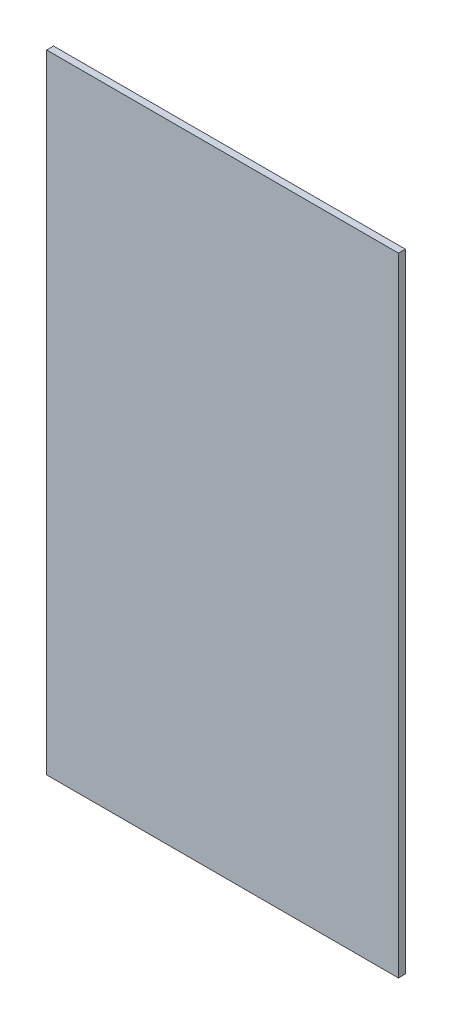
ISO-10303-21;
HEADER;
FILE_DESCRIPTION(('STEP AP214'),'2;1');
FILE_NAME('part.step','',(''),(''),'','','');
FILE_SCHEMA(('AUTOMOTIVE_DESIGN { 1 0 10303 214 1 1 1 1 }'));
ENDSEC;
DATA;
#1=APPLICATION_CONTEXT('core data for automotive mechanical design processes');
#2=APPLICATION_PROTOCOL_DEFINITION('international standard','automotive_design',2000,#1);
#3=PRODUCT_CONTEXT('',#1,'mechanical');
#4=PRODUCT('Part','Part','',(#3));
#5=PRODUCT_RELATED_PRODUCT_CATEGORY('part','',(#4));
#6=PRODUCT_DEFINITION_FORMATION('','',#4);
#7=PRODUCT_DEFINITION_CONTEXT('part definition',#1,'design');
#8=PRODUCT_DEFINITION('design','',#6,#7);
#9=PRODUCT_DEFINITION_SHAPE('','',#8);
#10=(LENGTH_UNIT() NAMED_UNIT(*) SI_UNIT(.MILLI.,.METRE.));
#11=(NAMED_UNIT(*) PLANE_ANGLE_UNIT() SI_UNIT($,.RADIAN.));
#12=(NAMED_UNIT(*) SI_UNIT($,.STERADIAN.) SOLID_ANGLE_UNIT());
#13=UNCERTAINTY_MEASURE_WITH_UNIT(LENGTH_MEASURE(1.E-05),#10,'distance_accuracy_value','');
#14=(GEOMETRIC_REPRESENTATION_CONTEXT(3) GLOBAL_UNCERTAINTY_ASSIGNED_CONTEXT((#13)) GLOBAL_UNIT_ASSIGNED_CONTEXT((#10,
#11,#12)) REPRESENTATION_CONTEXT('',''));
#15=CARTESIAN_POINT('',(0.,0.,0.));
#16=DIRECTION('',(0.,0.,1.));
#17=DIRECTION('',(1.,0.,0.));
#18=AXIS2_PLACEMENT_3D('',#15,#16,#17);
#19=CARTESIAN_POINT('',(22.5000000000001,477.5,-5.));
#20=DIRECTION('',(-1.,0.,0.));
#21=DIRECTION('',(0.,-1.,0.));
#22=AXIS2_PLACEMENT_3D('',#19,#20,#21);
#23=PLANE('',#22);
#24=DIRECTION('',(0.,-1.,0.));
#25=VECTOR('',#24,1.);
#26=CARTESIAN_POINT('',(22.5000000000001,477.5,0.));
#27=LINE('',#26,#25);
#28=CARTESIAN_POINT('',(22.5000000000001,477.5,0.));
#29=VERTEX_POINT('',#28);
#30=CARTESIAN_POINT('',(22.5000000000001,22.5,0.));
#31=VERTEX_POINT('',#30);
#32=EDGE_CURVE('E97',#29,#31,#27,.T.);
#33=ORIENTED_EDGE('',*,*,#32,.F.);
#34=DIRECTION('',(0.,0.,1.));
#35=VECTOR('',#34,1.);
#36=CARTESIAN_POINT('',(22.5000000000001,477.5,-5.));
#37=LINE('',#36,#35);
#38=CARTESIAN_POINT('',(22.5000000000001,477.5,-5.));
#39=VERTEX_POINT('',#38);
#40=EDGE_CURVE('E11',#39,#29,#37,.T.);
#41=ORIENTED_EDGE('',*,*,#40,.F.);
#42=DIRECTION('',(0.,-1.,0.));
#43=VECTOR('',#42,1.);
#44=CARTESIAN_POINT('',(22.5000000000001,477.5,-5.));
#45=LINE('',#44,#43);
#46=CARTESIAN_POINT('',(22.5000000000001,22.5,-5.));
#47=VERTEX_POINT('',#46);
#48=EDGE_CURVE('E91',#39,#47,#45,.T.);
#49=ORIENTED_EDGE('',*,*,#48,.T.);
#50=DIRECTION('',(0.,0.,1.));
#51=VECTOR('',#50,1.);
#52=CARTESIAN_POINT('',(22.5000000000001,22.5,-5.));
#53=LINE('',#52,#51);
#54=EDGE_CURVE('E36',#47,#31,#53,.T.);
#55=ORIENTED_EDGE('',*,*,#54,.T.);
#56=EDGE_LOOP('',(#33,#41,#49,#55));
#57=FACE_BOUND('',#56,.T.);
#58=ADVANCED_FACE('F33',(#57),#23,.T.);
#59=CARTESIAN_POINT('',(277.5,477.5,-5.));
#60=DIRECTION('',(0.,1.,0.));
#61=DIRECTION('',(-1.,0.,0.));
#62=AXIS2_PLACEMENT_3D('',#59,#60,#61);
#63=PLANE('',#62);
#64=DIRECTION('',(-1.,0.,0.));
#65=VECTOR('',#64,1.);
#66=CARTESIAN_POINT('',(277.5,477.5,0.));
#67=LINE('',#66,#65);
#68=CARTESIAN_POINT('',(277.5,477.5,0.));
#69=VERTEX_POINT('',#68);
#70=EDGE_CURVE('E93',#69,#29,#67,.T.);
#71=ORIENTED_EDGE('',*,*,#70,.F.);
#72=DIRECTION('',(0.,0.,1.));
#73=VECTOR('',#72,1.);
#74=CARTESIAN_POINT('',(277.5,477.5,-5.));
#75=LINE('',#74,#73);
#76=CARTESIAN_POINT('',(277.5,477.5,-5.));
#77=VERTEX_POINT('',#76);
#78=EDGE_CURVE('E42',#77,#69,#75,.T.);
#79=ORIENTED_EDGE('',*,*,#78,.F.);
#80=DIRECTION('',(-1.,0.,0.));
#81=VECTOR('',#80,1.);
#82=CARTESIAN_POINT('',(277.5,477.5,-5.));
#83=LINE('',#82,#81);
#84=EDGE_CURVE('E88',#77,#39,#83,.T.);
#85=ORIENTED_EDGE('',*,*,#84,.T.);
#86=ORIENTED_EDGE('',*,*,#40,.T.);
#87=EDGE_LOOP('',(#71,#79,#85,#86));
#88=FACE_BOUND('',#87,.T.);
#89=ADVANCED_FACE('F107',(#88),#63,.T.);
#90=CARTESIAN_POINT('',(277.5,22.5,-5.));
#91=DIRECTION('',(1.,0.,0.));
#92=DIRECTION('',(0.,1.,0.));
#93=AXIS2_PLACEMENT_3D('',#90,#91,#92);
#94=PLANE('',#93);
#95=DIRECTION('',(0.,1.,0.));
#96=VECTOR('',#95,1.);
#97=CARTESIAN_POINT('',(277.5,22.5,0.));
#98=LINE('',#97,#96);
#99=CARTESIAN_POINT('',(277.5,22.5,0.));
#100=VERTEX_POINT('',#99);
#101=EDGE_CURVE('E83',#100,#69,#98,.T.);
#102=ORIENTED_EDGE('',*,*,#101,.F.);
#103=DIRECTION('',(0.,0.,1.));
#104=VECTOR('',#103,1.);
#105=CARTESIAN_POINT('',(277.5,22.5,-5.));
#106=LINE('',#105,#104);
#107=CARTESIAN_POINT('',(277.5,22.5,-5.));
#108=VERTEX_POINT('',#107);
#109=EDGE_CURVE('E78',#108,#100,#106,.T.);
#110=ORIENTED_EDGE('',*,*,#109,.F.);
#111=DIRECTION('',(0.,1.,0.));
#112=VECTOR('',#111,1.);
#113=CARTESIAN_POINT('',(277.5,22.5,-5.));
#114=LINE('',#113,#112);
#115=EDGE_CURVE('E81',#108,#77,#114,.T.);
#116=ORIENTED_EDGE('',*,*,#115,.T.);
#117=ORIENTED_EDGE('',*,*,#78,.T.);
#118=EDGE_LOOP('',(#102,#110,#116,#117));
#119=FACE_BOUND('',#118,.T.);
#120=ADVANCED_FACE('F80',(#119),#94,.T.);
#121=CARTESIAN_POINT('',(22.5000000000001,22.5,-5.));
#122=DIRECTION('',(0.,-1.,0.));
#123=DIRECTION('',(0.,0.,-1.));
#124=AXIS2_PLACEMENT_3D('',#121,#122,#123);
#125=PLANE('',#124);
#126=DIRECTION('',(1.,0.,0.));
#127=VECTOR('',#126,1.);
#128=CARTESIAN_POINT('',(22.5000000000001,22.5,0.));
#129=LINE('',#128,#127);
#130=EDGE_CURVE('E100',#31,#100,#129,.T.);
#131=ORIENTED_EDGE('',*,*,#130,.F.);
#132=ORIENTED_EDGE('',*,*,#54,.F.);
#133=DIRECTION('',(1.,0.,0.));
#134=VECTOR('',#133,1.);
#135=CARTESIAN_POINT('',(22.5000000000001,22.5,-5.));
#136=LINE('',#135,#134);
#137=EDGE_CURVE('E87',#47,#108,#136,.T.);
#138=ORIENTED_EDGE('',*,*,#137,.T.);
#139=ORIENTED_EDGE('',*,*,#109,.T.);
#140=EDGE_LOOP('',(#131,#132,#138,#139));
#141=FACE_BOUND('',#140,.T.);
#142=ADVANCED_FACE('F90',(#141),#125,.T.);
#143=CARTESIAN_POINT('',(0.,0.,-5.));
#144=DIRECTION('',(0.,0.,1.));
#145=DIRECTION('',(1.,0.,0.));
#146=AXIS2_PLACEMENT_3D('',#143,#144,#145);
#147=PLANE('',#146);
#148=ORIENTED_EDGE('',*,*,#48,.F.);
#149=ORIENTED_EDGE('',*,*,#84,.F.);
#150=ORIENTED_EDGE('',*,*,#115,.F.);
#151=ORIENTED_EDGE('',*,*,#137,.F.);
#152=EDGE_LOOP('',(#148,#149,#150,#151));
#153=FACE_BOUND('',#152,.T.);
#154=ADVANCED_FACE('F86',(#153),#147,.F.);
#155=CARTESIAN_POINT('',(0.,0.,0.));
#156=DIRECTION('',(0.,0.,1.));
#157=DIRECTION('',(1.,0.,0.));
#158=AXIS2_PLACEMENT_3D('',#155,#156,#157);
#159=PLANE('',#158);
#160=ORIENTED_EDGE('',*,*,#32,.T.);
#161=ORIENTED_EDGE('',*,*,#130,.T.);
#162=ORIENTED_EDGE('',*,*,#101,.T.);
#163=ORIENTED_EDGE('',*,*,#70,.T.);
#164=EDGE_LOOP('',(#160,#161,#162,#163));
#165=FACE_BOUND('',#164,.T.);
#166=ADVANCED_FACE('F106',(#165),#159,.T.);
#167=CLOSED_SHELL('',(#58,#89,#120,#142,#154,#166));
#168=MANIFOLD_SOLID_BREP('B2',#167);
#169=ADVANCED_BREP_SHAPE_REPRESENTATION('',(#18,#168),#14);
#170=SHAPE_DEFINITION_REPRESENTATION(#9,#169);
ENDSEC;
END-ISO-10303-21;
